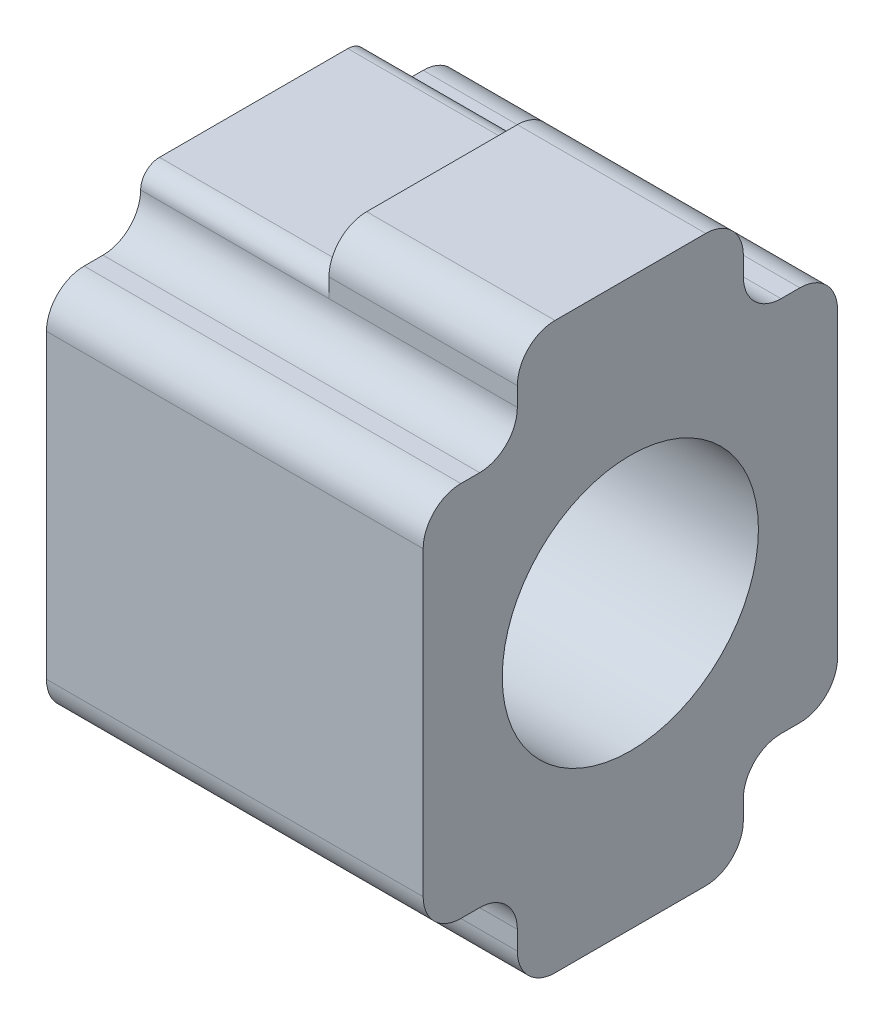
ISO-10303-21;
HEADER;
FILE_DESCRIPTION(('STEP AP214'),'2;1');
FILE_NAME('part.step','',(''),(''),'','','');
FILE_SCHEMA(('AUTOMOTIVE_DESIGN { 1 0 10303 214 1 1 1 1 }'));
ENDSEC;
DATA;
#1=APPLICATION_CONTEXT('core data for automotive mechanical design processes');
#2=APPLICATION_PROTOCOL_DEFINITION('international standard','automotive_design',2000,#1);
#3=PRODUCT_CONTEXT('',#1,'mechanical');
#4=PRODUCT('Part','Part','',(#3));
#5=PRODUCT_RELATED_PRODUCT_CATEGORY('part','',(#4));
#6=PRODUCT_DEFINITION_FORMATION('','',#4);
#7=PRODUCT_DEFINITION_CONTEXT('part definition',#1,'design');
#8=PRODUCT_DEFINITION('design','',#6,#7);
#9=PRODUCT_DEFINITION_SHAPE('','',#8);
#10=(LENGTH_UNIT() NAMED_UNIT(*) SI_UNIT(.MILLI.,.METRE.));
#11=(NAMED_UNIT(*) PLANE_ANGLE_UNIT() SI_UNIT($,.RADIAN.));
#12=(NAMED_UNIT(*) SI_UNIT($,.STERADIAN.) SOLID_ANGLE_UNIT());
#13=UNCERTAINTY_MEASURE_WITH_UNIT(LENGTH_MEASURE(1.E-05),#10,'distance_accuracy_value','');
#14=(GEOMETRIC_REPRESENTATION_CONTEXT(3) GLOBAL_UNCERTAINTY_ASSIGNED_CONTEXT((#13)) GLOBAL_UNIT_ASSIGNED_CONTEXT((#10,
#11,#12)) REPRESENTATION_CONTEXT('',''));
#15=CARTESIAN_POINT('',(0.,0.,0.));
#16=DIRECTION('',(0.,0.,1.));
#17=DIRECTION('',(1.,0.,0.));
#18=AXIS2_PLACEMENT_3D('',#15,#16,#17);
#19=CARTESIAN_POINT('',(10.,0.,0.));
#20=DIRECTION('',(0.,0.,-1.));
#21=DIRECTION('',(-1.,0.,0.));
#22=AXIS2_PLACEMENT_3D('',#19,#20,#21);
#23=PLANE('',#22);
#24=DIRECTION('',(0.,-1.,0.));
#25=VECTOR('',#24,1.);
#26=CARTESIAN_POINT('',(0.,0.,0.));
#27=LINE('',#26,#25);
#28=CARTESIAN_POINT('',(0.,11.5,0.));
#29=VERTEX_POINT('',#28);
#30=CARTESIAN_POINT('',(0.,3.5,0.));
#31=VERTEX_POINT('',#30);
#32=EDGE_CURVE('E354',#29,#31,#27,.T.);
#33=ORIENTED_EDGE('',*,*,#32,.T.);
#34=DIRECTION('',(1.,0.,0.));
#35=VECTOR('',#34,1.);
#36=CARTESIAN_POINT('',(10.,3.5,0.));
#37=LINE('',#36,#35);
#38=CARTESIAN_POINT('',(10.,3.5,0.));
#39=VERTEX_POINT('',#38);
#40=EDGE_CURVE('E412',#31,#39,#37,.T.);
#41=ORIENTED_EDGE('',*,*,#40,.T.);
#42=DIRECTION('',(0.,-1.,0.));
#43=VECTOR('',#42,1.);
#44=CARTESIAN_POINT('',(10.,0.,0.));
#45=LINE('',#44,#43);
#46=CARTESIAN_POINT('',(10.,11.5,0.));
#47=VERTEX_POINT('',#46);
#48=EDGE_CURVE('E357',#47,#39,#45,.T.);
#49=ORIENTED_EDGE('',*,*,#48,.F.);
#50=DIRECTION('',(-1.,0.,0.));
#51=VECTOR('',#50,1.);
#52=CARTESIAN_POINT('',(10.,11.5,0.));
#53=LINE('',#52,#51);
#54=EDGE_CURVE('E409',#47,#29,#53,.T.);
#55=ORIENTED_EDGE('',*,*,#54,.T.);
#56=EDGE_LOOP('',(#33,#41,#49,#55));
#57=FACE_BOUND('',#56,.T.);
#58=ADVANCED_FACE('F32',(#57),#23,.F.);
#59=CARTESIAN_POINT('',(10.,0.,0.));
#60=DIRECTION('',(0.,1.,0.));
#61=DIRECTION('',(0.,0.,1.));
#62=AXIS2_PLACEMENT_3D('',#59,#60,#61);
#63=PLANE('',#62);
#64=DIRECTION('',(-1.,0.,0.));
#65=VECTOR('',#64,1.);
#66=CARTESIAN_POINT('',(10.,0.,-3.49999999999999));
#67=LINE('',#66,#65);
#68=CARTESIAN_POINT('',(10.,0.,-3.49999999999999));
#69=VERTEX_POINT('',#68);
#70=CARTESIAN_POINT('',(5.,0.,-3.49999999999999));
#71=VERTEX_POINT('',#70);
#72=EDGE_CURVE('E254',#69,#71,#67,.T.);
#73=ORIENTED_EDGE('',*,*,#72,.T.);
#74=DIRECTION('',(0.,0.,-1.));
#75=VECTOR('',#74,1.);
#76=CARTESIAN_POINT('',(5.,0.,0.));
#77=LINE('',#76,#75);
#78=CARTESIAN_POINT('',(5.,0.,-7.5));
#79=VERTEX_POINT('',#78);
#80=EDGE_CURVE('E244',#71,#79,#77,.T.);
#81=ORIENTED_EDGE('',*,*,#80,.T.);
#82=DIRECTION('',(-1.,0.,0.));
#83=VECTOR('',#82,1.);
#84=CARTESIAN_POINT('',(10.,0.,-7.5));
#85=LINE('',#84,#83);
#86=CARTESIAN_POINT('',(10.,0.,-7.5));
#87=VERTEX_POINT('',#86);
#88=EDGE_CURVE('E258',#79,#87,#85,.F.);
#89=ORIENTED_EDGE('',*,*,#88,.T.);
#90=DIRECTION('',(0.,0.,-1.));
#91=VECTOR('',#90,1.);
#92=CARTESIAN_POINT('',(10.,0.,0.));
#93=LINE('',#92,#91);
#94=EDGE_CURVE('E360',#69,#87,#93,.T.);
#95=ORIENTED_EDGE('',*,*,#94,.F.);
#96=EDGE_LOOP('',(#73,#81,#89,#95));
#97=FACE_BOUND('',#96,.T.);
#98=ADVANCED_FACE('F423',(#97),#63,.F.);
#99=CARTESIAN_POINT('',(10.,0.,-11.));
#100=DIRECTION('',(0.,0.,1.));
#101=DIRECTION('',(1.,0.,0.));
#102=AXIS2_PLACEMENT_3D('',#99,#100,#101);
#103=PLANE('',#102);
#104=DIRECTION('',(0.,1.,0.));
#105=VECTOR('',#104,1.);
#106=CARTESIAN_POINT('',(10.,0.,-11.));
#107=LINE('',#106,#105);
#108=CARTESIAN_POINT('',(10.,3.5,-11.));
#109=VERTEX_POINT('',#108);
#110=CARTESIAN_POINT('',(10.,11.5,-11.));
#111=VERTEX_POINT('',#110);
#112=EDGE_CURVE('E364',#109,#111,#107,.T.);
#113=ORIENTED_EDGE('',*,*,#112,.F.);
#114=DIRECTION('',(-1.,0.,0.));
#115=VECTOR('',#114,1.);
#116=CARTESIAN_POINT('',(10.,3.5,-11.));
#117=LINE('',#116,#115);
#118=CARTESIAN_POINT('',(0.,3.5,-11.));
#119=VERTEX_POINT('',#118);
#120=EDGE_CURVE('E381',#109,#119,#117,.T.);
#121=ORIENTED_EDGE('',*,*,#120,.T.);
#122=DIRECTION('',(0.,1.,0.));
#123=VECTOR('',#122,1.);
#124=CARTESIAN_POINT('',(0.,0.,-11.));
#125=LINE('',#124,#123);
#126=CARTESIAN_POINT('',(0.,11.5,-11.));
#127=VERTEX_POINT('',#126);
#128=EDGE_CURVE('E361',#119,#127,#125,.T.);
#129=ORIENTED_EDGE('',*,*,#128,.T.);
#130=DIRECTION('',(1.,0.,0.));
#131=VECTOR('',#130,1.);
#132=CARTESIAN_POINT('',(10.,11.5,-11.));
#133=LINE('',#132,#131);
#134=EDGE_CURVE('E378',#127,#111,#133,.T.);
#135=ORIENTED_EDGE('',*,*,#134,.T.);
#136=EDGE_LOOP('',(#113,#121,#129,#135));
#137=FACE_BOUND('',#136,.T.);
#138=ADVANCED_FACE('F552',(#137),#103,.F.);
#139=CARTESIAN_POINT('',(10.,15.,0.));
#140=DIRECTION('',(0.,-1.,0.));
#141=DIRECTION('',(0.,0.,-1.));
#142=AXIS2_PLACEMENT_3D('',#139,#140,#141);
#143=PLANE('',#142);
#144=DIRECTION('',(-1.,0.,0.));
#145=VECTOR('',#144,1.);
#146=CARTESIAN_POINT('',(10.,15.,-7.5));
#147=LINE('',#146,#145);
#148=CARTESIAN_POINT('',(10.,15.,-7.5));
#149=VERTEX_POINT('',#148);
#150=CARTESIAN_POINT('',(5.,15.,-7.5));
#151=VERTEX_POINT('',#150);
#152=EDGE_CURVE('E263',#149,#151,#147,.T.);
#153=ORIENTED_EDGE('',*,*,#152,.T.);
#154=DIRECTION('',(0.,0.,1.));
#155=VECTOR('',#154,1.);
#156=CARTESIAN_POINT('',(5.,15.,0.));
#157=LINE('',#156,#155);
#158=CARTESIAN_POINT('',(5.,15.,-3.49999999999999));
#159=VERTEX_POINT('',#158);
#160=EDGE_CURVE('E311',#151,#159,#157,.T.);
#161=ORIENTED_EDGE('',*,*,#160,.T.);
#162=DIRECTION('',(-1.,0.,0.));
#163=VECTOR('',#162,1.);
#164=CARTESIAN_POINT('',(10.,15.,-3.49999999999999));
#165=LINE('',#164,#163);
#166=CARTESIAN_POINT('',(10.,15.,-3.49999999999999));
#167=VERTEX_POINT('',#166);
#168=EDGE_CURVE('E256',#159,#167,#165,.F.);
#169=ORIENTED_EDGE('',*,*,#168,.T.);
#170=DIRECTION('',(0.,0.,1.));
#171=VECTOR('',#170,1.);
#172=CARTESIAN_POINT('',(10.,15.,0.));
#173=LINE('',#172,#171);
#174=EDGE_CURVE('E367',#149,#167,#173,.T.);
#175=ORIENTED_EDGE('',*,*,#174,.F.);
#176=EDGE_LOOP('',(#153,#161,#169,#175));
#177=FACE_BOUND('',#176,.T.);
#178=ADVANCED_FACE('F617',(#177),#143,.F.);
#179=CARTESIAN_POINT('',(10.,15.,0.));
#180=DIRECTION('',(-1.,0.,0.));
#181=DIRECTION('',(0.,0.,1.));
#182=AXIS2_PLACEMENT_3D('',#179,#180,#181);
#183=PLANE('',#182);
#184=CARTESIAN_POINT('',(10.,7.5,-5.5));
#185=DIRECTION('',(-1.,0.,0.));
#186=DIRECTION('',(0.,0.,1.));
#187=AXIS2_PLACEMENT_3D('',#184,#185,#186);
#188=CIRCLE('',#187,3.4);
#189=CARTESIAN_POINT('',(10.,7.5,-2.1));
#190=VERTEX_POINT('',#189);
#191=EDGE_CURVE('E351',#190,#190,#188,.T.);
#192=ORIENTED_EDGE('',*,*,#191,.T.);
#193=EDGE_LOOP('',(#192));
#194=FACE_BOUND('',#193,.T.);
#195=DIRECTION('',(0.,0.,-1.));
#196=VECTOR('',#195,1.);
#197=CARTESIAN_POINT('',(10.,2.5,-12.5));
#198=LINE('',#197,#196);
#199=CARTESIAN_POINT('',(10.,2.5,-9.5));
#200=VERTEX_POINT('',#199);
#201=CARTESIAN_POINT('',(10.,2.5,-10.));
#202=VERTEX_POINT('',#201);
#203=EDGE_CURVE('E439',#200,#202,#198,.T.);
#204=ORIENTED_EDGE('',*,*,#203,.T.);
#205=CARTESIAN_POINT('',(10.,3.5,-10.));
#206=DIRECTION('',(-1.,0.,0.));
#207=DIRECTION('',(0.,0.,1.));
#208=AXIS2_PLACEMENT_3D('',#205,#206,#207);
#209=CIRCLE('',#208,1.);
#210=EDGE_CURVE('E407',#202,#109,#209,.F.);
#211=ORIENTED_EDGE('',*,*,#210,.T.);
#212=ORIENTED_EDGE('',*,*,#112,.T.);
#213=CARTESIAN_POINT('',(10.,11.5,-10.));
#214=DIRECTION('',(-1.,0.,0.));
#215=DIRECTION('',(0.,0.,1.));
#216=AXIS2_PLACEMENT_3D('',#213,#214,#215);
#217=CIRCLE('',#216,1.);
#218=CARTESIAN_POINT('',(10.,12.5,-10.));
#219=VERTEX_POINT('',#218);
#220=EDGE_CURVE('E401',#111,#219,#217,.F.);
#221=ORIENTED_EDGE('',*,*,#220,.T.);
#222=DIRECTION('',(0.,0.,1.));
#223=VECTOR('',#222,1.);
#224=CARTESIAN_POINT('',(10.,12.5,-9.5));
#225=LINE('',#224,#223);
#226=CARTESIAN_POINT('',(10.,12.5,-9.5));
#227=VERTEX_POINT('',#226);
#228=EDGE_CURVE('E443',#219,#227,#225,.T.);
#229=ORIENTED_EDGE('',*,*,#228,.T.);
#230=CARTESIAN_POINT('',(10.,13.5,-9.5));
#231=DIRECTION('',(-1.,0.,0.));
#232=DIRECTION('',(0.,0.,1.));
#233=AXIS2_PLACEMENT_3D('',#230,#231,#232);
#234=CIRCLE('',#233,0.999999999999998);
#235=CARTESIAN_POINT('',(10.,13.5,-8.5));
#236=VERTEX_POINT('',#235);
#237=EDGE_CURVE('E448',#227,#236,#234,.T.);
#238=ORIENTED_EDGE('',*,*,#237,.T.);
#239=DIRECTION('',(0.,1.,0.));
#240=VECTOR('',#239,1.);
#241=CARTESIAN_POINT('',(10.,15.,-8.5));
#242=LINE('',#241,#240);
#243=CARTESIAN_POINT('',(10.,14.,-8.5));
#244=VERTEX_POINT('',#243);
#245=EDGE_CURVE('E451',#236,#244,#242,.T.);
#246=ORIENTED_EDGE('',*,*,#245,.T.);
#247=CARTESIAN_POINT('',(10.,14.,-7.5));
#248=DIRECTION('',(-1.,0.,0.));
#249=DIRECTION('',(0.,0.,1.));
#250=AXIS2_PLACEMENT_3D('',#247,#248,#249);
#251=CIRCLE('',#250,1.);
#252=EDGE_CURVE('E396',#244,#149,#251,.F.);
#253=ORIENTED_EDGE('',*,*,#252,.T.);
#254=ORIENTED_EDGE('',*,*,#174,.T.);
#255=CARTESIAN_POINT('',(10.,14.,-3.49999999999999));
#256=DIRECTION('',(-1.,0.,0.));
#257=DIRECTION('',(0.,0.,1.));
#258=AXIS2_PLACEMENT_3D('',#255,#256,#257);
#259=CIRCLE('',#258,1.);
#260=CARTESIAN_POINT('',(10.,14.,-2.49999999999999));
#261=VERTEX_POINT('',#260);
#262=EDGE_CURVE('E394',#167,#261,#259,.F.);
#263=ORIENTED_EDGE('',*,*,#262,.T.);
#264=DIRECTION('',(0.,-1.,0.));
#265=VECTOR('',#264,1.);
#266=CARTESIAN_POINT('',(10.,15.,-2.49999999999999));
#267=LINE('',#266,#265);
#268=CARTESIAN_POINT('',(10.,13.5,-2.5));
#269=VERTEX_POINT('',#268);
#270=EDGE_CURVE('E475',#261,#269,#267,.T.);
#271=ORIENTED_EDGE('',*,*,#270,.T.);
#272=CARTESIAN_POINT('',(10.,13.5,-1.5));
#273=DIRECTION('',(-1.,0.,0.));
#274=DIRECTION('',(0.,0.,-1.));
#275=AXIS2_PLACEMENT_3D('',#272,#273,#274);
#276=CIRCLE('',#275,0.999999999999998);
#277=CARTESIAN_POINT('',(10.,12.5,-1.5));
#278=VERTEX_POINT('',#277);
#279=EDGE_CURVE('E493',#269,#278,#276,.T.);
#280=ORIENTED_EDGE('',*,*,#279,.T.);
#281=DIRECTION('',(0.,0.,1.));
#282=VECTOR('',#281,1.);
#283=CARTESIAN_POINT('',(10.,12.5,-1.5));
#284=LINE('',#283,#282);
#285=CARTESIAN_POINT('',(10.,12.5,-1.));
#286=VERTEX_POINT('',#285);
#287=EDGE_CURVE('E497',#278,#286,#284,.T.);
#288=ORIENTED_EDGE('',*,*,#287,.T.);
#289=CARTESIAN_POINT('',(10.,11.5,-1.));
#290=DIRECTION('',(-1.,0.,0.));
#291=DIRECTION('',(0.,0.,1.));
#292=AXIS2_PLACEMENT_3D('',#289,#290,#291);
#293=CIRCLE('',#292,1.);
#294=EDGE_CURVE('E403',#286,#47,#293,.F.);
#295=ORIENTED_EDGE('',*,*,#294,.T.);
#296=ORIENTED_EDGE('',*,*,#48,.T.);
#297=CARTESIAN_POINT('',(10.,3.5,-1.));
#298=DIRECTION('',(-1.,0.,0.));
#299=DIRECTION('',(0.,0.,1.));
#300=AXIS2_PLACEMENT_3D('',#297,#298,#299);
#301=CIRCLE('',#300,1.);
#302=CARTESIAN_POINT('',(10.,2.5,-1.));
#303=VERTEX_POINT('',#302);
#304=EDGE_CURVE('E405',#39,#303,#301,.F.);
#305=ORIENTED_EDGE('',*,*,#304,.T.);
#306=DIRECTION('',(0.,0.,-1.));
#307=VECTOR('',#306,1.);
#308=CARTESIAN_POINT('',(10.,2.5,1.5));
#309=LINE('',#308,#307);
#310=CARTESIAN_POINT('',(10.,2.5,-1.5));
#311=VERTEX_POINT('',#310);
#312=EDGE_CURVE('E500',#303,#311,#309,.T.);
#313=ORIENTED_EDGE('',*,*,#312,.T.);
#314=CARTESIAN_POINT('',(10.,1.5,-1.5));
#315=DIRECTION('',(-1.,0.,0.));
#316=DIRECTION('',(0.,0.,1.));
#317=AXIS2_PLACEMENT_3D('',#314,#315,#316);
#318=CIRCLE('',#317,0.999999999999998);
#319=CARTESIAN_POINT('',(10.,1.5,-2.5));
#320=VERTEX_POINT('',#319);
#321=EDGE_CURVE('E484',#311,#320,#318,.T.);
#322=ORIENTED_EDGE('',*,*,#321,.T.);
#323=DIRECTION('',(0.,-1.,0.));
#324=VECTOR('',#323,1.);
#325=CARTESIAN_POINT('',(10.,1.5,-2.49999999999999));
#326=LINE('',#325,#324);
#327=CARTESIAN_POINT('',(10.,1.,-2.49999999999999));
#328=VERTEX_POINT('',#327);
#329=EDGE_CURVE('E480',#320,#328,#326,.T.);
#330=ORIENTED_EDGE('',*,*,#329,.T.);
#331=CARTESIAN_POINT('',(10.,1.,-3.49999999999999));
#332=DIRECTION('',(-1.,0.,0.));
#333=DIRECTION('',(0.,0.,1.));
#334=AXIS2_PLACEMENT_3D('',#331,#332,#333);
#335=CIRCLE('',#334,1.);
#336=EDGE_CURVE('E252',#328,#69,#335,.F.);
#337=ORIENTED_EDGE('',*,*,#336,.T.);
#338=ORIENTED_EDGE('',*,*,#94,.T.);
#339=CARTESIAN_POINT('',(10.,1.,-7.5));
#340=DIRECTION('',(-1.,0.,0.));
#341=DIRECTION('',(0.,0.,1.));
#342=AXIS2_PLACEMENT_3D('',#339,#340,#341);
#343=CIRCLE('',#342,1.);
#344=CARTESIAN_POINT('',(10.,1.,-8.5));
#345=VERTEX_POINT('',#344);
#346=EDGE_CURVE('E398',#87,#345,#343,.F.);
#347=ORIENTED_EDGE('',*,*,#346,.T.);
#348=DIRECTION('',(0.,1.,0.));
#349=VECTOR('',#348,1.);
#350=CARTESIAN_POINT('',(10.,1.5,-8.5));
#351=LINE('',#350,#349);
#352=CARTESIAN_POINT('',(10.,1.5,-8.5));
#353=VERTEX_POINT('',#352);
#354=EDGE_CURVE('E331',#345,#353,#351,.T.);
#355=ORIENTED_EDGE('',*,*,#354,.T.);
#356=CARTESIAN_POINT('',(10.,1.5,-9.5));
#357=DIRECTION('',(-1.,0.,0.));
#358=DIRECTION('',(0.,0.,-1.));
#359=AXIS2_PLACEMENT_3D('',#356,#357,#358);
#360=CIRCLE('',#359,0.999999999999998);
#361=EDGE_CURVE('E334',#353,#200,#360,.T.);
#362=ORIENTED_EDGE('',*,*,#361,.T.);
#363=EDGE_LOOP('',(#204,#211,#212,#221,#229,#238,#246,#253,#254,#263,#271,#280,#288,#295,#296,
#305,#313,#322,#330,#337,#338,#347,#355,#362));
#364=FACE_BOUND('',#363,.T.);
#365=ADVANCED_FACE('F429',(#194,#364),#183,.F.);
#366=CARTESIAN_POINT('',(0.,15.,0.));
#367=DIRECTION('',(-1.,0.,0.));
#368=DIRECTION('',(0.,0.,1.));
#369=AXIS2_PLACEMENT_3D('',#366,#367,#368);
#370=PLANE('',#369);
#371=CARTESIAN_POINT('',(0.,1.5,-9.5));
#372=DIRECTION('',(-1.,0.,0.));
#373=DIRECTION('',(0.,0.,-1.));
#374=AXIS2_PLACEMENT_3D('',#371,#372,#373);
#375=CIRCLE('',#374,0.999999999999998);
#376=CARTESIAN_POINT('',(0.,1.5,-8.5));
#377=VERTEX_POINT('',#376);
#378=CARTESIAN_POINT('',(0.,2.5,-9.5));
#379=VERTEX_POINT('',#378);
#380=EDGE_CURVE('E337',#377,#379,#375,.T.);
#381=ORIENTED_EDGE('',*,*,#380,.F.);
#382=CARTESIAN_POINT('',(0.,1.5,-8.));
#383=DIRECTION('',(-1.,0.,0.));
#384=DIRECTION('',(0.,0.,1.));
#385=AXIS2_PLACEMENT_3D('',#382,#383,#384);
#386=CIRCLE('',#385,0.5);
#387=CARTESIAN_POINT('',(0.,1.,-8.));
#388=VERTEX_POINT('',#387);
#389=EDGE_CURVE('E281',#377,#388,#386,.T.);
#390=ORIENTED_EDGE('',*,*,#389,.T.);
#391=DIRECTION('',(0.,0.,-1.));
#392=VECTOR('',#391,1.);
#393=CARTESIAN_POINT('',(0.,1.,-19.0979187279652));
#394=LINE('',#393,#392);
#395=CARTESIAN_POINT('',(0.,1.,-3.));
#396=VERTEX_POINT('',#395);
#397=EDGE_CURVE('E523',#396,#388,#394,.T.);
#398=ORIENTED_EDGE('',*,*,#397,.F.);
#399=CARTESIAN_POINT('',(0.,1.5,-2.99999999999999));
#400=DIRECTION('',(-1.,0.,0.));
#401=DIRECTION('',(0.,0.,1.));
#402=AXIS2_PLACEMENT_3D('',#399,#400,#401);
#403=CIRCLE('',#402,0.5);
#404=CARTESIAN_POINT('',(0.,1.5,-2.5));
#405=VERTEX_POINT('',#404);
#406=EDGE_CURVE('E279',#396,#405,#403,.T.);
#407=ORIENTED_EDGE('',*,*,#406,.T.);
#408=CARTESIAN_POINT('',(0.,1.5,-1.5));
#409=DIRECTION('',(-1.,0.,0.));
#410=DIRECTION('',(0.,0.,1.));
#411=AXIS2_PLACEMENT_3D('',#408,#409,#410);
#412=CIRCLE('',#411,0.999999999999998);
#413=CARTESIAN_POINT('',(0.,2.5,-1.5));
#414=VERTEX_POINT('',#413);
#415=EDGE_CURVE('E467',#414,#405,#412,.T.);
#416=ORIENTED_EDGE('',*,*,#415,.F.);
#417=DIRECTION('',(0.,0.,-1.));
#418=VECTOR('',#417,1.);
#419=CARTESIAN_POINT('',(0.,2.5,0.));
#420=LINE('',#419,#418);
#421=CARTESIAN_POINT('',(0.,2.5,-1.));
#422=VERTEX_POINT('',#421);
#423=EDGE_CURVE('E376',#422,#414,#420,.T.);
#424=ORIENTED_EDGE('',*,*,#423,.F.);
#425=CARTESIAN_POINT('',(0.,3.5,-1.));
#426=DIRECTION('',(-1.,0.,0.));
#427=DIRECTION('',(0.,0.,1.));
#428=AXIS2_PLACEMENT_3D('',#425,#426,#427);
#429=CIRCLE('',#428,1.);
#430=EDGE_CURVE('E388',#422,#31,#429,.T.);
#431=ORIENTED_EDGE('',*,*,#430,.T.);
#432=ORIENTED_EDGE('',*,*,#32,.F.);
#433=CARTESIAN_POINT('',(0.,11.5,-1.));
#434=DIRECTION('',(-1.,0.,0.));
#435=DIRECTION('',(0.,0.,1.));
#436=AXIS2_PLACEMENT_3D('',#433,#434,#435);
#437=CIRCLE('',#436,1.);
#438=CARTESIAN_POINT('',(0.,12.5,-1.));
#439=VERTEX_POINT('',#438);
#440=EDGE_CURVE('E386',#29,#439,#437,.T.);
#441=ORIENTED_EDGE('',*,*,#440,.T.);
#442=DIRECTION('',(0.,0.,1.));
#443=VECTOR('',#442,1.);
#444=CARTESIAN_POINT('',(0.,12.5,-1.5));
#445=LINE('',#444,#443);
#446=CARTESIAN_POINT('',(0.,12.5,-1.5));
#447=VERTEX_POINT('',#446);
#448=EDGE_CURVE('E489',#447,#439,#445,.T.);
#449=ORIENTED_EDGE('',*,*,#448,.F.);
#450=CARTESIAN_POINT('',(0.,13.5,-1.5));
#451=DIRECTION('',(-1.,0.,0.));
#452=DIRECTION('',(0.,0.,-1.));
#453=AXIS2_PLACEMENT_3D('',#450,#451,#452);
#454=CIRCLE('',#453,0.999999999999998);
#455=CARTESIAN_POINT('',(0.,13.5,-2.5));
#456=VERTEX_POINT('',#455);
#457=EDGE_CURVE('E488',#456,#447,#454,.T.);
#458=ORIENTED_EDGE('',*,*,#457,.F.);
#459=CARTESIAN_POINT('',(0.,13.5,-3.));
#460=DIRECTION('',(-1.,0.,0.));
#461=DIRECTION('',(0.,0.,1.));
#462=AXIS2_PLACEMENT_3D('',#459,#460,#461);
#463=CIRCLE('',#462,0.5);
#464=CARTESIAN_POINT('',(0.,14.,-3.));
#465=VERTEX_POINT('',#464);
#466=EDGE_CURVE('E275',#456,#465,#463,.T.);
#467=ORIENTED_EDGE('',*,*,#466,.T.);
#468=DIRECTION('',(0.,0.,1.));
#469=VECTOR('',#468,1.);
#470=CARTESIAN_POINT('',(0.,14.,13.293643686012));
#471=LINE('',#470,#469);
#472=CARTESIAN_POINT('',(0.,14.,-8.));
#473=VERTEX_POINT('',#472);
#474=EDGE_CURVE('E248',#473,#465,#471,.T.);
#475=ORIENTED_EDGE('',*,*,#474,.F.);
#476=CARTESIAN_POINT('',(0.,13.5,-8.));
#477=DIRECTION('',(-1.,0.,0.));
#478=DIRECTION('',(0.,0.,1.));
#479=AXIS2_PLACEMENT_3D('',#476,#477,#478);
#480=CIRCLE('',#479,0.5);
#481=CARTESIAN_POINT('',(0.,13.5,-8.5));
#482=VERTEX_POINT('',#481);
#483=EDGE_CURVE('E277',#473,#482,#480,.T.);
#484=ORIENTED_EDGE('',*,*,#483,.T.);
#485=CARTESIAN_POINT('',(0.,13.5,-9.5));
#486=DIRECTION('',(-1.,0.,0.));
#487=DIRECTION('',(0.,0.,1.));
#488=AXIS2_PLACEMENT_3D('',#485,#486,#487);
#489=CIRCLE('',#488,0.999999999999998);
#490=CARTESIAN_POINT('',(0.,12.5,-9.5));
#491=VERTEX_POINT('',#490);
#492=EDGE_CURVE('E323',#491,#482,#489,.T.);
#493=ORIENTED_EDGE('',*,*,#492,.F.);
#494=DIRECTION('',(0.,0.,1.));
#495=VECTOR('',#494,1.);
#496=CARTESIAN_POINT('',(0.,12.5,0.));
#497=LINE('',#496,#495);
#498=CARTESIAN_POINT('',(0.,12.5,-10.));
#499=VERTEX_POINT('',#498);
#500=EDGE_CURVE('E370',#499,#491,#497,.T.);
#501=ORIENTED_EDGE('',*,*,#500,.F.);
#502=CARTESIAN_POINT('',(0.,11.5,-10.));
#503=DIRECTION('',(-1.,0.,0.));
#504=DIRECTION('',(0.,0.,1.));
#505=AXIS2_PLACEMENT_3D('',#502,#503,#504);
#506=CIRCLE('',#505,1.);
#507=EDGE_CURVE('E384',#499,#127,#506,.T.);
#508=ORIENTED_EDGE('',*,*,#507,.T.);
#509=ORIENTED_EDGE('',*,*,#128,.F.);
#510=CARTESIAN_POINT('',(0.,3.5,-10.));
#511=DIRECTION('',(-1.,0.,0.));
#512=DIRECTION('',(0.,0.,1.));
#513=AXIS2_PLACEMENT_3D('',#510,#511,#512);
#514=CIRCLE('',#513,1.);
#515=CARTESIAN_POINT('',(0.,2.5,-10.));
#516=VERTEX_POINT('',#515);
#517=EDGE_CURVE('E390',#119,#516,#514,.T.);
#518=ORIENTED_EDGE('',*,*,#517,.T.);
#519=DIRECTION('',(0.,0.,-1.));
#520=VECTOR('',#519,1.);
#521=CARTESIAN_POINT('',(0.,2.5,-12.5));
#522=LINE('',#521,#520);
#523=EDGE_CURVE('E332',#379,#516,#522,.T.);
#524=ORIENTED_EDGE('',*,*,#523,.F.);
#525=EDGE_LOOP('',(#381,#390,#398,#407,#416,#424,#431,#432,#441,#449,#458,#467,#475,#484,#493,
#501,#508,#509,#518,#524));
#526=FACE_BOUND('',#525,.T.);
#527=CARTESIAN_POINT('',(0.,7.5,-5.5));
#528=DIRECTION('',(-1.,0.,0.));
#529=DIRECTION('',(0.,0.,1.));
#530=AXIS2_PLACEMENT_3D('',#527,#528,#529);
#531=CIRCLE('',#530,3.4);
#532=CARTESIAN_POINT('',(0.,7.5,-2.1));
#533=VERTEX_POINT('',#532);
#534=EDGE_CURVE('E343',#533,#533,#531,.T.);
#535=ORIENTED_EDGE('',*,*,#534,.F.);
#536=EDGE_LOOP('',(#535));
#537=FACE_BOUND('',#536,.T.);
#538=ADVANCED_FACE('F320',(#526,#537),#370,.T.);
#539=CARTESIAN_POINT('',(10.,7.5,-5.5));
#540=DIRECTION('',(-1.,0.,0.));
#541=DIRECTION('',(0.,0.,1.));
#542=AXIS2_PLACEMENT_3D('',#539,#540,#541);
#543=CYLINDRICAL_SURFACE('',#542,3.4);
#544=ORIENTED_EDGE('',*,*,#191,.F.);
#545=EDGE_LOOP('',(#544));
#546=FACE_BOUND('',#545,.T.);
#547=ORIENTED_EDGE('',*,*,#534,.T.);
#548=EDGE_LOOP('',(#547));
#549=FACE_BOUND('',#548,.T.);
#550=ADVANCED_FACE('F567',(#546,#549),#543,.F.);
#551=CARTESIAN_POINT('',(10.,1.5,-8.5));
#552=DIRECTION('',(0.,0.,1.));
#553=DIRECTION('',(1.,0.,0.));
#554=AXIS2_PLACEMENT_3D('',#551,#552,#553);
#555=PLANE('',#554);
#556=DIRECTION('',(-1.,0.,0.));
#557=VECTOR('',#556,1.);
#558=CARTESIAN_POINT('',(10.,1.,-8.5));
#559=LINE('',#558,#557);
#560=CARTESIAN_POINT('',(5.,1.,-8.5));
#561=VERTEX_POINT('',#560);
#562=EDGE_CURVE('E253',#345,#561,#559,.T.);
#563=ORIENTED_EDGE('',*,*,#562,.T.);
#564=DIRECTION('',(0.,1.,0.));
#565=VECTOR('',#564,1.);
#566=CARTESIAN_POINT('',(5.,1.5,-8.5));
#567=LINE('',#566,#565);
#568=CARTESIAN_POINT('',(5.,1.5,-8.5));
#569=VERTEX_POINT('',#568);
#570=EDGE_CURVE('E54',#561,#569,#567,.T.);
#571=ORIENTED_EDGE('',*,*,#570,.T.);
#572=DIRECTION('',(-1.,0.,0.));
#573=VECTOR('',#572,1.);
#574=CARTESIAN_POINT('',(10.,1.5,-8.5));
#575=LINE('',#574,#573);
#576=EDGE_CURVE('E347',#353,#569,#575,.T.);
#577=ORIENTED_EDGE('',*,*,#576,.F.);
#578=ORIENTED_EDGE('',*,*,#354,.F.);
#579=EDGE_LOOP('',(#563,#571,#577,#578));
#580=FACE_BOUND('',#579,.T.);
#581=ADVANCED_FACE('F434',(#580),#555,.F.);
#582=CARTESIAN_POINT('',(10.,1.5,-9.5));
#583=DIRECTION('',(-1.,0.,0.));
#584=DIRECTION('',(0.,0.,1.));
#585=AXIS2_PLACEMENT_3D('',#582,#583,#584);
#586=CYLINDRICAL_SURFACE('',#585,0.999999999999998);
#587=ORIENTED_EDGE('',*,*,#380,.T.);
#588=DIRECTION('',(-1.,0.,0.));
#589=VECTOR('',#588,1.);
#590=CARTESIAN_POINT('',(10.,2.5,-9.5));
#591=LINE('',#590,#589);
#592=EDGE_CURVE('E345',#200,#379,#591,.T.);
#593=ORIENTED_EDGE('',*,*,#592,.F.);
#594=ORIENTED_EDGE('',*,*,#361,.F.);
#595=ORIENTED_EDGE('',*,*,#576,.T.);
#596=EDGE_CURVE('E350',#569,#377,#575,.T.);
#597=ORIENTED_EDGE('',*,*,#596,.T.);
#598=EDGE_LOOP('',(#587,#593,#594,#595,#597));
#599=FACE_BOUND('',#598,.T.);
#600=ADVANCED_FACE('F559',(#599),#586,.F.);
#601=CARTESIAN_POINT('',(10.,2.5,-12.5));
#602=DIRECTION('',(0.,1.,0.));
#603=DIRECTION('',(0.,0.,1.));
#604=AXIS2_PLACEMENT_3D('',#601,#602,#603);
#605=PLANE('',#604);
#606=ORIENTED_EDGE('',*,*,#523,.T.);
#607=DIRECTION('',(-1.,0.,0.));
#608=VECTOR('',#607,1.);
#609=CARTESIAN_POINT('',(10.,2.5,-10.));
#610=LINE('',#609,#608);
#611=EDGE_CURVE('E392',#516,#202,#610,.F.);
#612=ORIENTED_EDGE('',*,*,#611,.T.);
#613=ORIENTED_EDGE('',*,*,#203,.F.);
#614=ORIENTED_EDGE('',*,*,#592,.T.);
#615=EDGE_LOOP('',(#606,#612,#613,#614));
#616=FACE_BOUND('',#615,.T.);
#617=ADVANCED_FACE('F558',(#616),#605,.F.);
#618=CARTESIAN_POINT('',(10.,12.5,-9.5));
#619=DIRECTION('',(0.,-1.,0.));
#620=DIRECTION('',(0.,0.,-1.));
#621=AXIS2_PLACEMENT_3D('',#618,#619,#620);
#622=PLANE('',#621);
#623=ORIENTED_EDGE('',*,*,#228,.F.);
#624=DIRECTION('',(1.,0.,0.));
#625=VECTOR('',#624,1.);
#626=CARTESIAN_POINT('',(10.,12.5,-10.));
#627=LINE('',#626,#625);
#628=EDGE_CURVE('E419',#219,#499,#627,.F.);
#629=ORIENTED_EDGE('',*,*,#628,.T.);
#630=ORIENTED_EDGE('',*,*,#500,.T.);
#631=DIRECTION('',(-1.,0.,0.));
#632=VECTOR('',#631,1.);
#633=CARTESIAN_POINT('',(10.,12.5,-9.5));
#634=LINE('',#633,#632);
#635=EDGE_CURVE('E330',#227,#491,#634,.T.);
#636=ORIENTED_EDGE('',*,*,#635,.F.);
#637=EDGE_LOOP('',(#623,#629,#630,#636));
#638=FACE_BOUND('',#637,.T.);
#639=ADVANCED_FACE('F544',(#638),#622,.F.);
#640=CARTESIAN_POINT('',(10.,15.,-8.5));
#641=DIRECTION('',(0.,0.,1.));
#642=DIRECTION('',(1.,0.,0.));
#643=AXIS2_PLACEMENT_3D('',#640,#641,#642);
#644=PLANE('',#643);
#645=DIRECTION('',(-1.,0.,0.));
#646=VECTOR('',#645,1.);
#647=CARTESIAN_POINT('',(10.,13.5,-8.5));
#648=LINE('',#647,#646);
#649=CARTESIAN_POINT('',(5.,13.5,-8.5));
#650=VERTEX_POINT('',#649);
#651=EDGE_CURVE('E341',#236,#650,#648,.T.);
#652=ORIENTED_EDGE('',*,*,#651,.T.);
#653=DIRECTION('',(0.,1.,0.));
#654=VECTOR('',#653,1.);
#655=CARTESIAN_POINT('',(5.,15.,-8.5));
#656=LINE('',#655,#654);
#657=CARTESIAN_POINT('',(5.,14.,-8.5));
#658=VERTEX_POINT('',#657);
#659=EDGE_CURVE('E237',#650,#658,#656,.T.);
#660=ORIENTED_EDGE('',*,*,#659,.T.);
#661=DIRECTION('',(-1.,0.,0.));
#662=VECTOR('',#661,1.);
#663=CARTESIAN_POINT('',(10.,14.,-8.5));
#664=LINE('',#663,#662);
#665=EDGE_CURVE('E266',#658,#244,#664,.F.);
#666=ORIENTED_EDGE('',*,*,#665,.T.);
#667=ORIENTED_EDGE('',*,*,#245,.F.);
#668=EDGE_LOOP('',(#652,#660,#666,#667));
#669=FACE_BOUND('',#668,.T.);
#670=ADVANCED_FACE('F539',(#669),#644,.F.);
#671=CARTESIAN_POINT('',(10.,13.5,-9.5));
#672=DIRECTION('',(-1.,0.,0.));
#673=DIRECTION('',(0.,0.,1.));
#674=AXIS2_PLACEMENT_3D('',#671,#672,#673);
#675=CYLINDRICAL_SURFACE('',#674,0.999999999999998);
#676=ORIENTED_EDGE('',*,*,#492,.T.);
#677=EDGE_CURVE('E315',#650,#482,#648,.T.);
#678=ORIENTED_EDGE('',*,*,#677,.F.);
#679=ORIENTED_EDGE('',*,*,#651,.F.);
#680=ORIENTED_EDGE('',*,*,#237,.F.);
#681=ORIENTED_EDGE('',*,*,#635,.T.);
#682=EDGE_LOOP('',(#676,#678,#679,#680,#681));
#683=FACE_BOUND('',#682,.T.);
#684=ADVANCED_FACE('F326',(#683),#675,.F.);
#685=CARTESIAN_POINT('',(10.,12.5,-1.5));
#686=DIRECTION('',(0.,-1.,0.));
#687=DIRECTION('',(0.,0.,-1.));
#688=AXIS2_PLACEMENT_3D('',#685,#686,#687);
#689=PLANE('',#688);
#690=ORIENTED_EDGE('',*,*,#448,.T.);
#691=DIRECTION('',(-1.,0.,0.));
#692=VECTOR('',#691,1.);
#693=CARTESIAN_POINT('',(10.,12.5,-1.));
#694=LINE('',#693,#692);
#695=EDGE_CURVE('E417',#439,#286,#694,.F.);
#696=ORIENTED_EDGE('',*,*,#695,.T.);
#697=ORIENTED_EDGE('',*,*,#287,.F.);
#698=DIRECTION('',(-1.,0.,0.));
#699=VECTOR('',#698,1.);
#700=CARTESIAN_POINT('',(10.,12.5,-1.5));
#701=LINE('',#700,#699);
#702=EDGE_CURVE('E473',#278,#447,#701,.T.);
#703=ORIENTED_EDGE('',*,*,#702,.T.);
#704=EDGE_LOOP('',(#690,#696,#697,#703));
#705=FACE_BOUND('',#704,.T.);
#706=ADVANCED_FACE('F669',(#705),#689,.F.);
#707=CARTESIAN_POINT('',(10.,15.,-2.49999999999999));
#708=DIRECTION('',(0.,0.,-1.));
#709=DIRECTION('',(0.,1.,0.));
#710=AXIS2_PLACEMENT_3D('',#707,#708,#709);
#711=PLANE('',#710);
#712=DIRECTION('',(-1.,0.,0.));
#713=VECTOR('',#712,1.);
#714=CARTESIAN_POINT('',(10.,14.,-2.49999999999999));
#715=LINE('',#714,#713);
#716=CARTESIAN_POINT('',(5.,14.,-2.49999999999999));
#717=VERTEX_POINT('',#716);
#718=EDGE_CURVE('E268',#261,#717,#715,.T.);
#719=ORIENTED_EDGE('',*,*,#718,.T.);
#720=DIRECTION('',(0.,-1.,0.));
#721=VECTOR('',#720,1.);
#722=CARTESIAN_POINT('',(5.,15.,-2.49999999999999));
#723=LINE('',#722,#721);
#724=CARTESIAN_POINT('',(5.,13.5,-2.5));
#725=VERTEX_POINT('',#724);
#726=EDGE_CURVE('E46',#717,#725,#723,.T.);
#727=ORIENTED_EDGE('',*,*,#726,.T.);
#728=DIRECTION('',(-1.,0.,0.));
#729=VECTOR('',#728,1.);
#730=CARTESIAN_POINT('',(10.,13.5,-2.5));
#731=LINE('',#730,#729);
#732=EDGE_CURVE('E454',#269,#725,#731,.T.);
#733=ORIENTED_EDGE('',*,*,#732,.F.);
#734=ORIENTED_EDGE('',*,*,#270,.F.);
#735=EDGE_LOOP('',(#719,#727,#733,#734));
#736=FACE_BOUND('',#735,.T.);
#737=ADVANCED_FACE('F613',(#736),#711,.F.);
#738=CARTESIAN_POINT('',(10.,13.5,-1.5));
#739=DIRECTION('',(-1.,0.,0.));
#740=DIRECTION('',(0.,0.,1.));
#741=AXIS2_PLACEMENT_3D('',#738,#739,#740);
#742=CYLINDRICAL_SURFACE('',#741,0.999999999999998);
#743=ORIENTED_EDGE('',*,*,#457,.T.);
#744=ORIENTED_EDGE('',*,*,#702,.F.);
#745=ORIENTED_EDGE('',*,*,#279,.F.);
#746=ORIENTED_EDGE('',*,*,#732,.T.);
#747=EDGE_CURVE('E458',#725,#456,#731,.T.);
#748=ORIENTED_EDGE('',*,*,#747,.T.);
#749=EDGE_LOOP('',(#743,#744,#745,#746,#748));
#750=FACE_BOUND('',#749,.T.);
#751=ADVANCED_FACE('F680',(#750),#742,.F.);
#752=CARTESIAN_POINT('',(10.,2.5,1.5));
#753=DIRECTION('',(0.,1.,0.));
#754=DIRECTION('',(0.,0.,1.));
#755=AXIS2_PLACEMENT_3D('',#752,#753,#754);
#756=PLANE('',#755);
#757=ORIENTED_EDGE('',*,*,#312,.F.);
#758=DIRECTION('',(1.,0.,0.));
#759=VECTOR('',#758,1.);
#760=CARTESIAN_POINT('',(10.,2.5,-1.));
#761=LINE('',#760,#759);
#762=EDGE_CURVE('E415',#303,#422,#761,.F.);
#763=ORIENTED_EDGE('',*,*,#762,.T.);
#764=ORIENTED_EDGE('',*,*,#423,.T.);
#765=DIRECTION('',(-1.,0.,0.));
#766=VECTOR('',#765,1.);
#767=CARTESIAN_POINT('',(10.,2.5,-1.5));
#768=LINE('',#767,#766);
#769=EDGE_CURVE('E471',#311,#414,#768,.T.);
#770=ORIENTED_EDGE('',*,*,#769,.F.);
#771=EDGE_LOOP('',(#757,#763,#764,#770));
#772=FACE_BOUND('',#771,.T.);
#773=ADVANCED_FACE('F689',(#772),#756,.F.);
#774=CARTESIAN_POINT('',(10.,1.5,-2.49999999999999));
#775=DIRECTION('',(0.,0.,-1.));
#776=DIRECTION('',(0.,1.,0.));
#777=AXIS2_PLACEMENT_3D('',#774,#775,#776);
#778=PLANE('',#777);
#779=DIRECTION('',(-1.,0.,0.));
#780=VECTOR('',#779,1.);
#781=CARTESIAN_POINT('',(10.,1.5,-2.5));
#782=LINE('',#781,#780);
#783=CARTESIAN_POINT('',(5.,1.5,-2.5));
#784=VERTEX_POINT('',#783);
#785=EDGE_CURVE('E235',#320,#784,#782,.T.);
#786=ORIENTED_EDGE('',*,*,#785,.T.);
#787=DIRECTION('',(0.,-1.,0.));
#788=VECTOR('',#787,1.);
#789=CARTESIAN_POINT('',(5.,1.5,-2.49999999999999));
#790=LINE('',#789,#788);
#791=CARTESIAN_POINT('',(5.,1.,-2.49999999999999));
#792=VERTEX_POINT('',#791);
#793=EDGE_CURVE('E228',#784,#792,#790,.T.);
#794=ORIENTED_EDGE('',*,*,#793,.T.);
#795=DIRECTION('',(-1.,0.,0.));
#796=VECTOR('',#795,1.);
#797=CARTESIAN_POINT('',(10.,1.,-2.49999999999999));
#798=LINE('',#797,#796);
#799=EDGE_CURVE('E233',#792,#328,#798,.F.);
#800=ORIENTED_EDGE('',*,*,#799,.T.);
#801=ORIENTED_EDGE('',*,*,#329,.F.);
#802=EDGE_LOOP('',(#786,#794,#800,#801));
#803=FACE_BOUND('',#802,.T.);
#804=ADVANCED_FACE('F230',(#803),#778,.F.);
#805=CARTESIAN_POINT('',(10.,1.5,-1.5));
#806=DIRECTION('',(-1.,0.,0.));
#807=DIRECTION('',(0.,0.,1.));
#808=AXIS2_PLACEMENT_3D('',#805,#806,#807);
#809=CYLINDRICAL_SURFACE('',#808,0.999999999999998);
#810=ORIENTED_EDGE('',*,*,#415,.T.);
#811=EDGE_CURVE('E470',#784,#405,#782,.T.);
#812=ORIENTED_EDGE('',*,*,#811,.F.);
#813=ORIENTED_EDGE('',*,*,#785,.F.);
#814=ORIENTED_EDGE('',*,*,#321,.F.);
#815=ORIENTED_EDGE('',*,*,#769,.T.);
#816=EDGE_LOOP('',(#810,#812,#813,#814,#815));
#817=FACE_BOUND('',#816,.T.);
#818=ADVANCED_FACE('F509',(#817),#809,.F.);
#819=CARTESIAN_POINT('',(10.,3.5,-10.));
#820=DIRECTION('',(-1.,0.,0.));
#821=DIRECTION('',(0.,0.,1.));
#822=AXIS2_PLACEMENT_3D('',#819,#820,#821);
#823=CYLINDRICAL_SURFACE('',#822,1.);
#824=ORIENTED_EDGE('',*,*,#210,.F.);
#825=ORIENTED_EDGE('',*,*,#611,.F.);
#826=ORIENTED_EDGE('',*,*,#517,.F.);
#827=ORIENTED_EDGE('',*,*,#120,.F.);
#828=EDGE_LOOP('',(#824,#825,#826,#827));
#829=FACE_BOUND('',#828,.T.);
#830=ADVANCED_FACE('F556',(#829),#823,.T.);
#831=CARTESIAN_POINT('',(10.,3.5,-1.));
#832=DIRECTION('',(1.,0.,0.));
#833=DIRECTION('',(0.,0.,-1.));
#834=AXIS2_PLACEMENT_3D('',#831,#832,#833);
#835=CYLINDRICAL_SURFACE('',#834,1.);
#836=ORIENTED_EDGE('',*,*,#430,.F.);
#837=ORIENTED_EDGE('',*,*,#762,.F.);
#838=ORIENTED_EDGE('',*,*,#304,.F.);
#839=ORIENTED_EDGE('',*,*,#40,.F.);
#840=EDGE_LOOP('',(#836,#837,#838,#839));
#841=FACE_BOUND('',#840,.T.);
#842=ADVANCED_FACE('F580',(#841),#835,.T.);
#843=CARTESIAN_POINT('',(10.,11.5,-1.));
#844=DIRECTION('',(-1.,0.,0.));
#845=DIRECTION('',(0.,0.,1.));
#846=AXIS2_PLACEMENT_3D('',#843,#844,#845);
#847=CYLINDRICAL_SURFACE('',#846,1.);
#848=ORIENTED_EDGE('',*,*,#294,.F.);
#849=ORIENTED_EDGE('',*,*,#695,.F.);
#850=ORIENTED_EDGE('',*,*,#440,.F.);
#851=ORIENTED_EDGE('',*,*,#54,.F.);
#852=EDGE_LOOP('',(#848,#849,#850,#851));
#853=FACE_BOUND('',#852,.T.);
#854=ADVANCED_FACE('F583',(#853),#847,.T.);
#855=CARTESIAN_POINT('',(10.,11.5,-10.));
#856=DIRECTION('',(1.,0.,0.));
#857=DIRECTION('',(0.,0.,-1.));
#858=AXIS2_PLACEMENT_3D('',#855,#856,#857);
#859=CYLINDRICAL_SURFACE('',#858,1.);
#860=ORIENTED_EDGE('',*,*,#507,.F.);
#861=ORIENTED_EDGE('',*,*,#628,.F.);
#862=ORIENTED_EDGE('',*,*,#220,.F.);
#863=ORIENTED_EDGE('',*,*,#134,.F.);
#864=EDGE_LOOP('',(#860,#861,#862,#863));
#865=FACE_BOUND('',#864,.T.);
#866=ADVANCED_FACE('F549',(#865),#859,.T.);
#867=CARTESIAN_POINT('',(10.,1.,-3.49999999999999));
#868=DIRECTION('',(-1.,0.,0.));
#869=DIRECTION('',(0.,0.,1.));
#870=AXIS2_PLACEMENT_3D('',#867,#868,#869);
#871=CYLINDRICAL_SURFACE('',#870,1.);
#872=CARTESIAN_POINT('',(5.,1.,-3.49999999999999));
#873=DIRECTION('',(1.,0.,0.));
#874=DIRECTION('',(0.,0.,-1.));
#875=AXIS2_PLACEMENT_3D('',#872,#873,#874);
#876=CIRCLE('',#875,1.);
#877=EDGE_CURVE('E241',#71,#792,#876,.F.);
#878=ORIENTED_EDGE('',*,*,#877,.F.);
#879=ORIENTED_EDGE('',*,*,#72,.F.);
#880=ORIENTED_EDGE('',*,*,#336,.F.);
#881=ORIENTED_EDGE('',*,*,#799,.F.);
#882=EDGE_LOOP('',(#878,#879,#880,#881));
#883=FACE_BOUND('',#882,.T.);
#884=ADVANCED_FACE('F251',(#883),#871,.T.);
#885=CARTESIAN_POINT('',(10.,1.,-7.5));
#886=DIRECTION('',(-1.,0.,0.));
#887=DIRECTION('',(0.,0.,1.));
#888=AXIS2_PLACEMENT_3D('',#885,#886,#887);
#889=CYLINDRICAL_SURFACE('',#888,1.);
#890=CARTESIAN_POINT('',(5.,1.,-7.5));
#891=DIRECTION('',(1.,0.,0.));
#892=DIRECTION('',(0.,0.,-1.));
#893=AXIS2_PLACEMENT_3D('',#890,#891,#892);
#894=CIRCLE('',#893,1.);
#895=EDGE_CURVE('E272',#561,#79,#894,.F.);
#896=ORIENTED_EDGE('',*,*,#895,.F.);
#897=ORIENTED_EDGE('',*,*,#562,.F.);
#898=ORIENTED_EDGE('',*,*,#346,.F.);
#899=ORIENTED_EDGE('',*,*,#88,.F.);
#900=EDGE_LOOP('',(#896,#897,#898,#899));
#901=FACE_BOUND('',#900,.T.);
#902=ADVANCED_FACE('F432',(#901),#889,.T.);
#903=CARTESIAN_POINT('',(10.,14.,-7.5));
#904=DIRECTION('',(-1.,0.,0.));
#905=DIRECTION('',(0.,0.,1.));
#906=AXIS2_PLACEMENT_3D('',#903,#904,#905);
#907=CYLINDRICAL_SURFACE('',#906,1.);
#908=CARTESIAN_POINT('',(5.,14.,-7.5));
#909=DIRECTION('',(1.,0.,0.));
#910=DIRECTION('',(0.,0.,-1.));
#911=AXIS2_PLACEMENT_3D('',#908,#909,#910);
#912=CIRCLE('',#911,1.);
#913=EDGE_CURVE('E490',#151,#658,#912,.F.);
#914=ORIENTED_EDGE('',*,*,#913,.F.);
#915=ORIENTED_EDGE('',*,*,#152,.F.);
#916=ORIENTED_EDGE('',*,*,#252,.F.);
#917=ORIENTED_EDGE('',*,*,#665,.F.);
#918=EDGE_LOOP('',(#914,#915,#916,#917));
#919=FACE_BOUND('',#918,.T.);
#920=ADVANCED_FACE('F536',(#919),#907,.T.);
#921=CARTESIAN_POINT('',(10.,14.,-3.49999999999999));
#922=DIRECTION('',(-1.,0.,0.));
#923=DIRECTION('',(0.,0.,1.));
#924=AXIS2_PLACEMENT_3D('',#921,#922,#923);
#925=CYLINDRICAL_SURFACE('',#924,1.);
#926=CARTESIAN_POINT('',(5.,14.,-3.49999999999999));
#927=DIRECTION('',(1.,0.,0.));
#928=DIRECTION('',(0.,0.,-1.));
#929=AXIS2_PLACEMENT_3D('',#926,#927,#928);
#930=CIRCLE('',#929,1.);
#931=EDGE_CURVE('E270',#717,#159,#930,.F.);
#932=ORIENTED_EDGE('',*,*,#931,.F.);
#933=ORIENTED_EDGE('',*,*,#718,.F.);
#934=ORIENTED_EDGE('',*,*,#262,.F.);
#935=ORIENTED_EDGE('',*,*,#168,.F.);
#936=EDGE_LOOP('',(#932,#933,#934,#935));
#937=FACE_BOUND('',#936,.T.);
#938=ADVANCED_FACE('F596',(#937),#925,.T.);
#939=CARTESIAN_POINT('',(5.,14.,13.293643686012));
#940=DIRECTION('',(0.,-1.,0.));
#941=DIRECTION('',(0.,0.,-1.));
#942=AXIS2_PLACEMENT_3D('',#939,#940,#941);
#943=PLANE('',#942);
#944=DIRECTION('',(0.,0.,1.));
#945=VECTOR('',#944,1.);
#946=CARTESIAN_POINT('',(5.,14.,13.293643686012));
#947=LINE('',#946,#945);
#948=CARTESIAN_POINT('',(5.,14.,-8.));
#949=VERTEX_POINT('',#948);
#950=CARTESIAN_POINT('',(5.,14.,-3.));
#951=VERTEX_POINT('',#950);
#952=EDGE_CURVE('E300',#949,#951,#947,.T.);
#953=ORIENTED_EDGE('',*,*,#952,.F.);
#954=DIRECTION('',(1.,0.,0.));
#955=VECTOR('',#954,1.);
#956=CARTESIAN_POINT('',(5.,14.,-8.));
#957=LINE('',#956,#955);
#958=EDGE_CURVE('E289',#949,#473,#957,.F.);
#959=ORIENTED_EDGE('',*,*,#958,.T.);
#960=ORIENTED_EDGE('',*,*,#474,.T.);
#961=DIRECTION('',(-1.,0.,0.));
#962=VECTOR('',#961,1.);
#963=CARTESIAN_POINT('',(5.,14.,-3.));
#964=LINE('',#963,#962);
#965=EDGE_CURVE('E287',#465,#951,#964,.F.);
#966=ORIENTED_EDGE('',*,*,#965,.T.);
#967=EDGE_LOOP('',(#953,#959,#960,#966));
#968=FACE_BOUND('',#967,.T.);
#969=ADVANCED_FACE('F307',(#968),#943,.F.);
#970=CARTESIAN_POINT('',(5.,0.,0.));
#971=DIRECTION('',(1.,0.,0.));
#972=DIRECTION('',(0.,0.,-1.));
#973=AXIS2_PLACEMENT_3D('',#970,#971,#972);
#974=PLANE('',#973);
#975=ORIENTED_EDGE('',*,*,#913,.T.);
#976=ORIENTED_EDGE('',*,*,#659,.F.);
#977=CARTESIAN_POINT('',(5.,13.5,-8.));
#978=DIRECTION('',(1.,0.,0.));
#979=DIRECTION('',(0.,0.,-1.));
#980=AXIS2_PLACEMENT_3D('',#977,#978,#979);
#981=CIRCLE('',#980,0.5);
#982=EDGE_CURVE('E40',#650,#949,#981,.T.);
#983=ORIENTED_EDGE('',*,*,#982,.T.);
#984=ORIENTED_EDGE('',*,*,#952,.T.);
#985=CARTESIAN_POINT('',(5.,13.5,-3.));
#986=DIRECTION('',(1.,0.,0.));
#987=DIRECTION('',(0.,0.,-1.));
#988=AXIS2_PLACEMENT_3D('',#985,#986,#987);
#989=CIRCLE('',#988,0.5);
#990=EDGE_CURVE('E11',#951,#725,#989,.T.);
#991=ORIENTED_EDGE('',*,*,#990,.T.);
#992=ORIENTED_EDGE('',*,*,#726,.F.);
#993=ORIENTED_EDGE('',*,*,#931,.T.);
#994=ORIENTED_EDGE('',*,*,#160,.F.);
#995=EDGE_LOOP('',(#975,#976,#983,#984,#991,#992,#993,#994));
#996=FACE_BOUND('',#995,.T.);
#997=ADVANCED_FACE('F299',(#996),#974,.F.);
#998=CARTESIAN_POINT('',(5.,1.,-19.0979187279652));
#999=DIRECTION('',(0.,1.,0.));
#1000=DIRECTION('',(0.,0.,1.));
#1001=AXIS2_PLACEMENT_3D('',#998,#999,#1000);
#1002=PLANE('',#1001);
#1003=ORIENTED_EDGE('',*,*,#397,.T.);
#1004=DIRECTION('',(-1.,0.,0.));
#1005=VECTOR('',#1004,1.);
#1006=CARTESIAN_POINT('',(5.,1.,-8.));
#1007=LINE('',#1006,#1005);
#1008=CARTESIAN_POINT('',(5.,1.,-8.));
#1009=VERTEX_POINT('',#1008);
#1010=EDGE_CURVE('E238',#388,#1009,#1007,.F.);
#1011=ORIENTED_EDGE('',*,*,#1010,.T.);
#1012=DIRECTION('',(0.,0.,-1.));
#1013=VECTOR('',#1012,1.);
#1014=CARTESIAN_POINT('',(5.,1.,-19.0979187279652));
#1015=LINE('',#1014,#1013);
#1016=CARTESIAN_POINT('',(5.,1.,-3.));
#1017=VERTEX_POINT('',#1016);
#1018=EDGE_CURVE('E516',#1017,#1009,#1015,.T.);
#1019=ORIENTED_EDGE('',*,*,#1018,.F.);
#1020=DIRECTION('',(1.,0.,0.));
#1021=VECTOR('',#1020,1.);
#1022=CARTESIAN_POINT('',(5.,1.,-3.));
#1023=LINE('',#1022,#1021);
#1024=EDGE_CURVE('E283',#1017,#396,#1023,.F.);
#1025=ORIENTED_EDGE('',*,*,#1024,.T.);
#1026=EDGE_LOOP('',(#1003,#1011,#1019,#1025));
#1027=FACE_BOUND('',#1026,.T.);
#1028=ADVANCED_FACE('F520',(#1027),#1002,.F.);
#1029=CARTESIAN_POINT('',(5.,0.,0.));
#1030=DIRECTION('',(1.,0.,0.));
#1031=DIRECTION('',(0.,0.,-1.));
#1032=AXIS2_PLACEMENT_3D('',#1029,#1030,#1031);
#1033=PLANE('',#1032);
#1034=ORIENTED_EDGE('',*,*,#877,.T.);
#1035=ORIENTED_EDGE('',*,*,#793,.F.);
#1036=CARTESIAN_POINT('',(5.,1.5,-2.99999999999999));
#1037=DIRECTION('',(1.,0.,0.));
#1038=DIRECTION('',(0.,0.,-1.));
#1039=AXIS2_PLACEMENT_3D('',#1036,#1037,#1038);
#1040=CIRCLE('',#1039,0.5);
#1041=EDGE_CURVE('E294',#784,#1017,#1040,.T.);
#1042=ORIENTED_EDGE('',*,*,#1041,.T.);
#1043=ORIENTED_EDGE('',*,*,#1018,.T.);
#1044=CARTESIAN_POINT('',(5.,1.5,-8.));
#1045=DIRECTION('',(1.,0.,0.));
#1046=DIRECTION('',(0.,0.,-1.));
#1047=AXIS2_PLACEMENT_3D('',#1044,#1045,#1046);
#1048=CIRCLE('',#1047,0.5);
#1049=EDGE_CURVE('E292',#1009,#569,#1048,.T.);
#1050=ORIENTED_EDGE('',*,*,#1049,.T.);
#1051=ORIENTED_EDGE('',*,*,#570,.F.);
#1052=ORIENTED_EDGE('',*,*,#895,.T.);
#1053=ORIENTED_EDGE('',*,*,#80,.F.);
#1054=EDGE_LOOP('',(#1034,#1035,#1042,#1043,#1050,#1051,#1052,#1053));
#1055=FACE_BOUND('',#1054,.T.);
#1056=ADVANCED_FACE('F242',(#1055),#1033,.F.);
#1057=CARTESIAN_POINT('',(10.,1.5,-8.));
#1058=DIRECTION('',(-1.,0.,0.));
#1059=DIRECTION('',(0.,0.,1.));
#1060=AXIS2_PLACEMENT_3D('',#1057,#1058,#1059);
#1061=CYLINDRICAL_SURFACE('',#1060,0.5);
#1062=ORIENTED_EDGE('',*,*,#1049,.F.);
#1063=ORIENTED_EDGE('',*,*,#1010,.F.);
#1064=ORIENTED_EDGE('',*,*,#389,.F.);
#1065=ORIENTED_EDGE('',*,*,#596,.F.);
#1066=EDGE_LOOP('',(#1062,#1063,#1064,#1065));
#1067=FACE_BOUND('',#1066,.T.);
#1068=ADVANCED_FACE('F600',(#1067),#1061,.T.);
#1069=CARTESIAN_POINT('',(10.,1.5,-2.99999999999999));
#1070=DIRECTION('',(1.,0.,0.));
#1071=DIRECTION('',(0.,0.,-1.));
#1072=AXIS2_PLACEMENT_3D('',#1069,#1070,#1071);
#1073=CYLINDRICAL_SURFACE('',#1072,0.5);
#1074=ORIENTED_EDGE('',*,*,#406,.F.);
#1075=ORIENTED_EDGE('',*,*,#1024,.F.);
#1076=ORIENTED_EDGE('',*,*,#1041,.F.);
#1077=ORIENTED_EDGE('',*,*,#811,.T.);
#1078=EDGE_LOOP('',(#1074,#1075,#1076,#1077));
#1079=FACE_BOUND('',#1078,.T.);
#1080=ADVANCED_FACE('F512',(#1079),#1073,.T.);
#1081=CARTESIAN_POINT('',(10.,13.5,-8.));
#1082=DIRECTION('',(1.,0.,0.));
#1083=DIRECTION('',(0.,0.,-1.));
#1084=AXIS2_PLACEMENT_3D('',#1081,#1082,#1083);
#1085=CYLINDRICAL_SURFACE('',#1084,0.5);
#1086=ORIENTED_EDGE('',*,*,#483,.F.);
#1087=ORIENTED_EDGE('',*,*,#958,.F.);
#1088=ORIENTED_EDGE('',*,*,#982,.F.);
#1089=ORIENTED_EDGE('',*,*,#677,.T.);
#1090=EDGE_LOOP('',(#1086,#1087,#1088,#1089));
#1091=FACE_BOUND('',#1090,.T.);
#1092=ADVANCED_FACE('F314',(#1091),#1085,.T.);
#1093=CARTESIAN_POINT('',(10.,13.5,-3.));
#1094=DIRECTION('',(-1.,0.,0.));
#1095=DIRECTION('',(0.,0.,1.));
#1096=AXIS2_PLACEMENT_3D('',#1093,#1094,#1095);
#1097=CYLINDRICAL_SURFACE('',#1096,0.5);
#1098=ORIENTED_EDGE('',*,*,#990,.F.);
#1099=ORIENTED_EDGE('',*,*,#965,.F.);
#1100=ORIENTED_EDGE('',*,*,#466,.F.);
#1101=ORIENTED_EDGE('',*,*,#747,.F.);
#1102=EDGE_LOOP('',(#1098,#1099,#1100,#1101));
#1103=FACE_BOUND('',#1102,.T.);
#1104=ADVANCED_FACE('F34',(#1103),#1097,.T.);
#1105=CLOSED_SHELL('',(#58,#98,#138,#178,#365,#538,#550,#581,#600,#617,#639,#670,#684,#706,#737,
#751,#773,#804,#818,#830,#842,#854,#866,#884,#902,#920,#938,#969,#997,#1028,#1056,#1068,#1080,
#1092,#1104));
#1106=MANIFOLD_SOLID_BREP('B2',#1105);
#1107=ADVANCED_BREP_SHAPE_REPRESENTATION('',(#18,#1106),#14);
#1108=SHAPE_DEFINITION_REPRESENTATION(#9,#1107);
ENDSEC;
END-ISO-10303-21;
